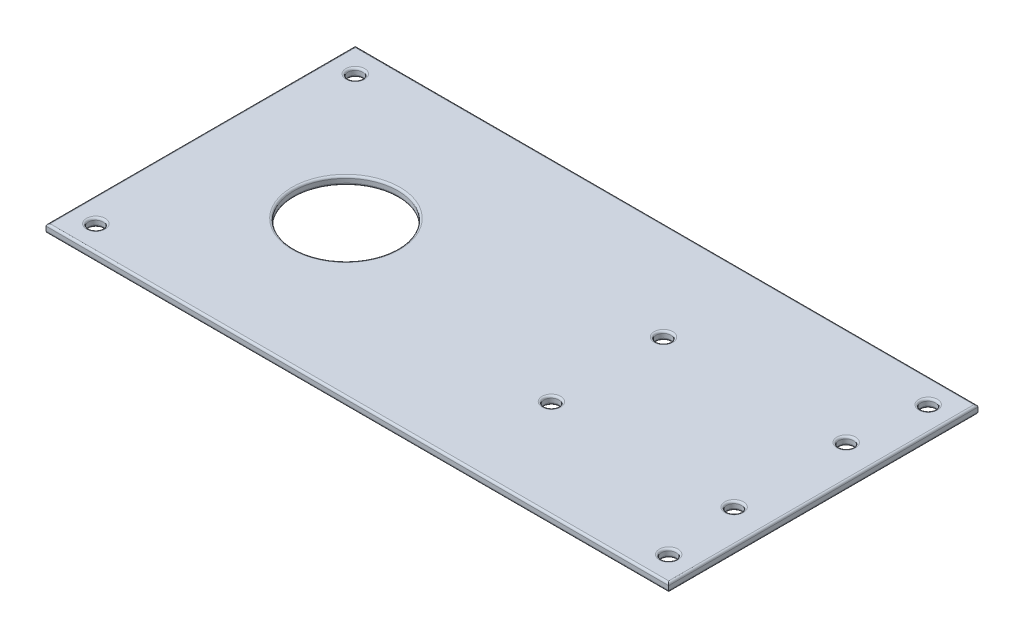
ISO-10303-21;
HEADER;
FILE_DESCRIPTION(('STEP AP214'),'2;1');
FILE_NAME('part.step','',(''),(''),'','','');
FILE_SCHEMA(('AUTOMOTIVE_DESIGN { 1 0 10303 214 1 1 1 1 }'));
ENDSEC;
DATA;
#1=APPLICATION_CONTEXT('core data for automotive mechanical design processes');
#2=APPLICATION_PROTOCOL_DEFINITION('international standard','automotive_design',2000,#1);
#3=PRODUCT_CONTEXT('',#1,'mechanical');
#4=PRODUCT('Part','Part','',(#3));
#5=PRODUCT_RELATED_PRODUCT_CATEGORY('part','',(#4));
#6=PRODUCT_DEFINITION_FORMATION('','',#4);
#7=PRODUCT_DEFINITION_CONTEXT('part definition',#1,'design');
#8=PRODUCT_DEFINITION('design','',#6,#7);
#9=PRODUCT_DEFINITION_SHAPE('','',#8);
#10=(LENGTH_UNIT() NAMED_UNIT(*) SI_UNIT(.MILLI.,.METRE.));
#11=(NAMED_UNIT(*) PLANE_ANGLE_UNIT() SI_UNIT($,.RADIAN.));
#12=(NAMED_UNIT(*) SI_UNIT($,.STERADIAN.) SOLID_ANGLE_UNIT());
#13=UNCERTAINTY_MEASURE_WITH_UNIT(LENGTH_MEASURE(1.E-05),#10,'distance_accuracy_value','');
#14=(GEOMETRIC_REPRESENTATION_CONTEXT(3) GLOBAL_UNCERTAINTY_ASSIGNED_CONTEXT((#13)) GLOBAL_UNIT_ASSIGNED_CONTEXT((#10,
#11,#12)) REPRESENTATION_CONTEXT('',''));
#15=CARTESIAN_POINT('',(0.,0.,0.));
#16=DIRECTION('',(0.,0.,1.));
#17=DIRECTION('',(1.,0.,0.));
#18=AXIS2_PLACEMENT_3D('',#15,#16,#17);
#19=CARTESIAN_POINT('',(0.,2.,0.));
#20=DIRECTION('',(0.,-1.,0.));
#21=DIRECTION('',(0.,0.,-1.));
#22=AXIS2_PLACEMENT_3D('',#19,#20,#21);
#23=PLANE('',#22);
#24=CARTESIAN_POINT('',(98.,2.,-23.75));
#25=DIRECTION('',(0.,-1.,0.));
#26=DIRECTION('',(0.,0.,-1.));
#27=AXIS2_PLACEMENT_3D('',#24,#25,#26);
#28=CIRCLE('',#27,2.25);
#29=CARTESIAN_POINT('',(98.,2.,-26.));
#30=VERTEX_POINT('',#29);
#31=EDGE_CURVE('E11',#30,#30,#28,.T.);
#32=ORIENTED_EDGE('',*,*,#31,.T.);
#33=EDGE_LOOP('',(#32));
#34=FACE_BOUND('',#33,.T.);
#35=CARTESIAN_POINT('',(142.,2.,-23.75));
#36=DIRECTION('',(0.,-1.,0.));
#37=DIRECTION('',(0.,0.,-1.));
#38=AXIS2_PLACEMENT_3D('',#35,#36,#37);
#39=CIRCLE('',#38,2.25000000000001);
#40=CARTESIAN_POINT('',(142.,2.,-26.));
#41=VERTEX_POINT('',#40);
#42=EDGE_CURVE('E48',#41,#41,#39,.T.);
#43=ORIENTED_EDGE('',*,*,#42,.T.);
#44=EDGE_LOOP('',(#43));
#45=FACE_BOUND('',#44,.T.);
#46=CARTESIAN_POINT('',(142.,2.,-50.75));
#47=DIRECTION('',(0.,-1.,0.));
#48=DIRECTION('',(0.,0.,-1.));
#49=AXIS2_PLACEMENT_3D('',#46,#47,#48);
#50=CIRCLE('',#49,2.25000000000001);
#51=CARTESIAN_POINT('',(142.,2.,-53.));
#52=VERTEX_POINT('',#51);
#53=EDGE_CURVE('E250',#52,#52,#50,.T.);
#54=ORIENTED_EDGE('',*,*,#53,.T.);
#55=EDGE_LOOP('',(#54));
#56=FACE_BOUND('',#55,.T.);
#57=CARTESIAN_POINT('',(98.,2.,-50.75));
#58=DIRECTION('',(0.,-1.,0.));
#59=DIRECTION('',(0.,0.,-1.));
#60=AXIS2_PLACEMENT_3D('',#57,#58,#59);
#61=CIRCLE('',#60,2.25);
#62=CARTESIAN_POINT('',(98.,2.,-53.));
#63=VERTEX_POINT('',#62);
#64=EDGE_CURVE('E243',#63,#63,#61,.T.);
#65=ORIENTED_EDGE('',*,*,#64,.T.);
#66=EDGE_LOOP('',(#65));
#67=FACE_BOUND('',#66,.T.);
#68=CARTESIAN_POINT('',(6.,2.,-6.00000000000001));
#69=DIRECTION('',(0.,-1.,0.));
#70=DIRECTION('',(0.,0.,-1.));
#71=AXIS2_PLACEMENT_3D('',#68,#69,#70);
#72=CIRCLE('',#71,2.25);
#73=CARTESIAN_POINT('',(6.,2.,-8.25000000000001));
#74=VERTEX_POINT('',#73);
#75=EDGE_CURVE('E241',#74,#74,#72,.T.);
#76=ORIENTED_EDGE('',*,*,#75,.T.);
#77=EDGE_LOOP('',(#76));
#78=FACE_BOUND('',#77,.T.);
#79=CARTESIAN_POINT('',(6.,2.,-68.5));
#80=DIRECTION('',(0.,-1.,0.));
#81=DIRECTION('',(0.,0.,-1.));
#82=AXIS2_PLACEMENT_3D('',#79,#80,#81);
#83=CIRCLE('',#82,2.25);
#84=CARTESIAN_POINT('',(6.,2.,-70.75));
#85=VERTEX_POINT('',#84);
#86=EDGE_CURVE('E236',#85,#85,#83,.T.);
#87=ORIENTED_EDGE('',*,*,#86,.T.);
#88=EDGE_LOOP('',(#87));
#89=FACE_BOUND('',#88,.T.);
#90=CARTESIAN_POINT('',(35.,2.,-37.25));
#91=DIRECTION('',(0.,-1.,0.));
#92=DIRECTION('',(0.,0.,-1.));
#93=AXIS2_PLACEMENT_3D('',#90,#91,#92);
#94=CIRCLE('',#93,13.);
#95=CARTESIAN_POINT('',(35.,2.,-50.25));
#96=VERTEX_POINT('',#95);
#97=EDGE_CURVE('E232',#96,#96,#94,.T.);
#98=ORIENTED_EDGE('',*,*,#97,.T.);
#99=EDGE_LOOP('',(#98));
#100=FACE_BOUND('',#99,.T.);
#101=CARTESIAN_POINT('',(144.,2.,-68.5));
#102=DIRECTION('',(0.,-1.,0.));
#103=DIRECTION('',(0.,0.,-1.));
#104=AXIS2_PLACEMENT_3D('',#101,#102,#103);
#105=CIRCLE('',#104,2.25000000000001);
#106=CARTESIAN_POINT('',(144.,2.,-70.75));
#107=VERTEX_POINT('',#106);
#108=EDGE_CURVE('E235',#107,#107,#105,.T.);
#109=ORIENTED_EDGE('',*,*,#108,.T.);
#110=EDGE_LOOP('',(#109));
#111=FACE_BOUND('',#110,.T.);
#112=CARTESIAN_POINT('',(144.,2.,-6.));
#113=DIRECTION('',(0.,-1.,0.));
#114=DIRECTION('',(0.,0.,-1.));
#115=AXIS2_PLACEMENT_3D('',#112,#113,#114);
#116=CIRCLE('',#115,2.25000000000001);
#117=CARTESIAN_POINT('',(144.,2.,-8.25000000000001));
#118=VERTEX_POINT('',#117);
#119=EDGE_CURVE('E228',#118,#118,#116,.T.);
#120=ORIENTED_EDGE('',*,*,#119,.T.);
#121=EDGE_LOOP('',(#120));
#122=FACE_BOUND('',#121,.T.);
#123=DIRECTION('',(0.,0.,-1.));
#124=VECTOR('',#123,1.);
#125=CARTESIAN_POINT('',(149.5,2.,0.));
#126=LINE('',#125,#124);
#127=CARTESIAN_POINT('',(149.5,2.,-0.5));
#128=VERTEX_POINT('',#127);
#129=CARTESIAN_POINT('',(149.5,2.,-74.));
#130=VERTEX_POINT('',#129);
#131=EDGE_CURVE('E57',#128,#130,#126,.T.);
#132=ORIENTED_EDGE('',*,*,#131,.T.);
#133=DIRECTION('',(-1.,0.,0.));
#134=VECTOR('',#133,1.);
#135=CARTESIAN_POINT('',(0.,2.,-74.));
#136=LINE('',#135,#134);
#137=CARTESIAN_POINT('',(0.5,2.,-74.));
#138=VERTEX_POINT('',#137);
#139=EDGE_CURVE('E227',#130,#138,#136,.T.);
#140=ORIENTED_EDGE('',*,*,#139,.T.);
#141=DIRECTION('',(0.,0.,1.));
#142=VECTOR('',#141,1.);
#143=CARTESIAN_POINT('',(0.5,2.,0.));
#144=LINE('',#143,#142);
#145=CARTESIAN_POINT('',(0.5,2.,-0.5));
#146=VERTEX_POINT('',#145);
#147=EDGE_CURVE('E224',#138,#146,#144,.T.);
#148=ORIENTED_EDGE('',*,*,#147,.T.);
#149=DIRECTION('',(1.,0.,0.));
#150=VECTOR('',#149,1.);
#151=CARTESIAN_POINT('',(0.,2.,-0.5));
#152=LINE('',#151,#150);
#153=EDGE_CURVE('E61',#146,#128,#152,.T.);
#154=ORIENTED_EDGE('',*,*,#153,.T.);
#155=EDGE_LOOP('',(#132,#140,#148,#154));
#156=FACE_BOUND('',#155,.T.);
#157=ADVANCED_FACE('F39',(#34,#45,#56,#67,#78,#89,#100,#111,#122,#156),#23,.F.);
#158=CARTESIAN_POINT('',(0.,0.,0.));
#159=DIRECTION('',(0.,-1.,0.));
#160=DIRECTION('',(0.,0.,-1.));
#161=AXIS2_PLACEMENT_3D('',#158,#159,#160);
#162=PLANE('',#161);
#163=CARTESIAN_POINT('',(98.,0.,-23.75));
#164=DIRECTION('',(0.,-1.,0.));
#165=DIRECTION('',(0.,0.,-1.));
#166=AXIS2_PLACEMENT_3D('',#163,#164,#165);
#167=CIRCLE('',#166,2.25);
#168=CARTESIAN_POINT('',(98.,0.,-26.));
#169=VERTEX_POINT('',#168);
#170=EDGE_CURVE('E147',#169,#169,#167,.F.);
#171=ORIENTED_EDGE('',*,*,#170,.T.);
#172=EDGE_LOOP('',(#171));
#173=FACE_BOUND('',#172,.T.);
#174=CARTESIAN_POINT('',(142.,0.,-50.75));
#175=DIRECTION('',(0.,-1.,0.));
#176=DIRECTION('',(0.,0.,-1.));
#177=AXIS2_PLACEMENT_3D('',#174,#175,#176);
#178=CIRCLE('',#177,2.25000000000001);
#179=CARTESIAN_POINT('',(142.,0.,-53.));
#180=VERTEX_POINT('',#179);
#181=EDGE_CURVE('E150',#180,#180,#178,.F.);
#182=ORIENTED_EDGE('',*,*,#181,.T.);
#183=EDGE_LOOP('',(#182));
#184=FACE_BOUND('',#183,.T.);
#185=CARTESIAN_POINT('',(6.,0.,-6.00000000000001));
#186=DIRECTION('',(0.,-1.,0.));
#187=DIRECTION('',(0.,0.,-1.));
#188=AXIS2_PLACEMENT_3D('',#185,#186,#187);
#189=CIRCLE('',#188,2.25);
#190=CARTESIAN_POINT('',(6.,0.,-8.25000000000001));
#191=VERTEX_POINT('',#190);
#192=EDGE_CURVE('E145',#191,#191,#189,.F.);
#193=ORIENTED_EDGE('',*,*,#192,.T.);
#194=EDGE_LOOP('',(#193));
#195=FACE_BOUND('',#194,.T.);
#196=CARTESIAN_POINT('',(35.,0.,-37.25));
#197=DIRECTION('',(0.,-1.,0.));
#198=DIRECTION('',(0.,0.,-1.));
#199=AXIS2_PLACEMENT_3D('',#196,#197,#198);
#200=CIRCLE('',#199,13.);
#201=CARTESIAN_POINT('',(35.,0.,-50.25));
#202=VERTEX_POINT('',#201);
#203=EDGE_CURVE('E140',#202,#202,#200,.F.);
#204=ORIENTED_EDGE('',*,*,#203,.T.);
#205=EDGE_LOOP('',(#204));
#206=FACE_BOUND('',#205,.T.);
#207=CARTESIAN_POINT('',(144.,0.,-6.));
#208=DIRECTION('',(0.,-1.,0.));
#209=DIRECTION('',(0.,0.,-1.));
#210=AXIS2_PLACEMENT_3D('',#207,#208,#209);
#211=CIRCLE('',#210,2.25000000000001);
#212=CARTESIAN_POINT('',(144.,0.,-8.25000000000001));
#213=VERTEX_POINT('',#212);
#214=EDGE_CURVE('E133',#213,#213,#211,.F.);
#215=ORIENTED_EDGE('',*,*,#214,.T.);
#216=EDGE_LOOP('',(#215));
#217=FACE_BOUND('',#216,.T.);
#218=DIRECTION('',(0.,0.,-1.));
#219=VECTOR('',#218,1.);
#220=CARTESIAN_POINT('',(149.5,0.,0.));
#221=LINE('',#220,#219);
#222=CARTESIAN_POINT('',(149.5,0.,-74.));
#223=VERTEX_POINT('',#222);
#224=CARTESIAN_POINT('',(149.5,0.,-0.5));
#225=VERTEX_POINT('',#224);
#226=EDGE_CURVE('E134',#223,#225,#221,.F.);
#227=ORIENTED_EDGE('',*,*,#226,.T.);
#228=DIRECTION('',(1.,0.,0.));
#229=VECTOR('',#228,1.);
#230=CARTESIAN_POINT('',(0.,0.,-0.5));
#231=LINE('',#230,#229);
#232=CARTESIAN_POINT('',(0.5,0.,-0.5));
#233=VERTEX_POINT('',#232);
#234=EDGE_CURVE('E112',#225,#233,#231,.F.);
#235=ORIENTED_EDGE('',*,*,#234,.T.);
#236=DIRECTION('',(0.,0.,1.));
#237=VECTOR('',#236,1.);
#238=CARTESIAN_POINT('',(0.5,0.,-74.5));
#239=LINE('',#238,#237);
#240=CARTESIAN_POINT('',(0.5,0.,-74.));
#241=VERTEX_POINT('',#240);
#242=EDGE_CURVE('E123',#233,#241,#239,.F.);
#243=ORIENTED_EDGE('',*,*,#242,.T.);
#244=DIRECTION('',(-1.,0.,0.));
#245=VECTOR('',#244,1.);
#246=CARTESIAN_POINT('',(150.,0.,-74.));
#247=LINE('',#246,#245);
#248=EDGE_CURVE('E130',#241,#223,#247,.F.);
#249=ORIENTED_EDGE('',*,*,#248,.T.);
#250=EDGE_LOOP('',(#227,#235,#243,#249));
#251=FACE_BOUND('',#250,.T.);
#252=CARTESIAN_POINT('',(144.,0.,-68.5));
#253=DIRECTION('',(0.,-1.,0.));
#254=DIRECTION('',(0.,0.,-1.));
#255=AXIS2_PLACEMENT_3D('',#252,#253,#254);
#256=CIRCLE('',#255,2.25000000000001);
#257=CARTESIAN_POINT('',(144.,0.,-70.75));
#258=VERTEX_POINT('',#257);
#259=EDGE_CURVE('E126',#258,#258,#256,.F.);
#260=ORIENTED_EDGE('',*,*,#259,.T.);
#261=EDGE_LOOP('',(#260));
#262=FACE_BOUND('',#261,.T.);
#263=CARTESIAN_POINT('',(6.,0.,-68.5));
#264=DIRECTION('',(0.,-1.,0.));
#265=DIRECTION('',(0.,0.,-1.));
#266=AXIS2_PLACEMENT_3D('',#263,#264,#265);
#267=CIRCLE('',#266,2.25);
#268=CARTESIAN_POINT('',(6.,0.,-70.75));
#269=VERTEX_POINT('',#268);
#270=EDGE_CURVE('E293',#269,#269,#267,.F.);
#271=ORIENTED_EDGE('',*,*,#270,.T.);
#272=EDGE_LOOP('',(#271));
#273=FACE_BOUND('',#272,.T.);
#274=CARTESIAN_POINT('',(98.,0.,-50.75));
#275=DIRECTION('',(0.,-1.,0.));
#276=DIRECTION('',(0.,0.,-1.));
#277=AXIS2_PLACEMENT_3D('',#274,#275,#276);
#278=CIRCLE('',#277,2.25);
#279=CARTESIAN_POINT('',(98.,0.,-53.));
#280=VERTEX_POINT('',#279);
#281=EDGE_CURVE('E290',#280,#280,#278,.F.);
#282=ORIENTED_EDGE('',*,*,#281,.T.);
#283=EDGE_LOOP('',(#282));
#284=FACE_BOUND('',#283,.T.);
#285=CARTESIAN_POINT('',(142.,0.,-23.75));
#286=DIRECTION('',(0.,-1.,0.));
#287=DIRECTION('',(0.,0.,-1.));
#288=AXIS2_PLACEMENT_3D('',#285,#286,#287);
#289=CIRCLE('',#288,2.25000000000001);
#290=CARTESIAN_POINT('',(142.,0.,-26.));
#291=VERTEX_POINT('',#290);
#292=EDGE_CURVE('E283',#291,#291,#289,.F.);
#293=ORIENTED_EDGE('',*,*,#292,.T.);
#294=EDGE_LOOP('',(#293));
#295=FACE_BOUND('',#294,.T.);
#296=ADVANCED_FACE('F128',(#173,#184,#195,#206,#217,#251,#262,#273,#284,#295),#162,.T.);
#297=CARTESIAN_POINT('',(0.,2.,0.));
#298=DIRECTION('',(1.,0.,0.));
#299=DIRECTION('',(0.,0.,-1.));
#300=AXIS2_PLACEMENT_3D('',#297,#298,#299);
#301=PLANE('',#300);
#302=DIRECTION('',(0.,-1.,0.));
#303=VECTOR('',#302,1.);
#304=CARTESIAN_POINT('',(0.,2.,-74.5));
#305=LINE('',#304,#303);
#306=CARTESIAN_POINT('',(0.,1.5,-74.5));
#307=VERTEX_POINT('',#306);
#308=CARTESIAN_POINT('',(0.,0.5,-74.5));
#309=VERTEX_POINT('',#308);
#310=EDGE_CURVE('E258',#307,#309,#305,.T.);
#311=ORIENTED_EDGE('',*,*,#310,.T.);
#312=DIRECTION('',(0.,0.,1.));
#313=VECTOR('',#312,1.);
#314=CARTESIAN_POINT('',(0.,0.5,0.));
#315=LINE('',#314,#313);
#316=CARTESIAN_POINT('',(0.,0.5,0.));
#317=VERTEX_POINT('',#316);
#318=EDGE_CURVE('E197',#309,#317,#315,.T.);
#319=ORIENTED_EDGE('',*,*,#318,.T.);
#320=DIRECTION('',(0.,-1.,0.));
#321=VECTOR('',#320,1.);
#322=CARTESIAN_POINT('',(0.,2.,0.));
#323=LINE('',#322,#321);
#324=CARTESIAN_POINT('',(0.,1.5,0.));
#325=VERTEX_POINT('',#324);
#326=EDGE_CURVE('E280',#325,#317,#323,.T.);
#327=ORIENTED_EDGE('',*,*,#326,.F.);
#328=DIRECTION('',(0.,0.,1.));
#329=VECTOR('',#328,1.);
#330=CARTESIAN_POINT('',(0.,1.5,0.));
#331=LINE('',#330,#329);
#332=EDGE_CURVE('E192',#325,#307,#331,.F.);
#333=ORIENTED_EDGE('',*,*,#332,.T.);
#334=EDGE_LOOP('',(#311,#319,#327,#333));
#335=FACE_BOUND('',#334,.T.);
#336=ADVANCED_FACE('F282',(#335),#301,.F.);
#337=CARTESIAN_POINT('',(0.,2.,0.));
#338=DIRECTION('',(0.,0.,-1.));
#339=DIRECTION('',(-1.,0.,0.));
#340=AXIS2_PLACEMENT_3D('',#337,#338,#339);
#341=PLANE('',#340);
#342=ORIENTED_EDGE('',*,*,#326,.T.);
#343=DIRECTION('',(1.,0.,0.));
#344=VECTOR('',#343,1.);
#345=CARTESIAN_POINT('',(150.,0.5,0.));
#346=LINE('',#345,#344);
#347=CARTESIAN_POINT('',(150.,0.5,0.));
#348=VERTEX_POINT('',#347);
#349=EDGE_CURVE('E111',#317,#348,#346,.T.);
#350=ORIENTED_EDGE('',*,*,#349,.T.);
#351=DIRECTION('',(0.,-1.,0.));
#352=VECTOR('',#351,1.);
#353=CARTESIAN_POINT('',(150.,2.,0.));
#354=LINE('',#353,#352);
#355=CARTESIAN_POINT('',(150.,1.5,0.));
#356=VERTEX_POINT('',#355);
#357=EDGE_CURVE('E276',#356,#348,#354,.T.);
#358=ORIENTED_EDGE('',*,*,#357,.F.);
#359=DIRECTION('',(1.,0.,0.));
#360=VECTOR('',#359,1.);
#361=CARTESIAN_POINT('',(0.,1.5,0.));
#362=LINE('',#361,#360);
#363=EDGE_CURVE('E181',#356,#325,#362,.F.);
#364=ORIENTED_EDGE('',*,*,#363,.T.);
#365=EDGE_LOOP('',(#342,#350,#358,#364));
#366=FACE_BOUND('',#365,.T.);
#367=ADVANCED_FACE('F277',(#366),#341,.F.);
#368=CARTESIAN_POINT('',(150.,2.,0.));
#369=DIRECTION('',(-1.,0.,0.));
#370=DIRECTION('',(0.,0.,1.));
#371=AXIS2_PLACEMENT_3D('',#368,#369,#370);
#372=PLANE('',#371);
#373=ORIENTED_EDGE('',*,*,#357,.T.);
#374=DIRECTION('',(0.,0.,-1.));
#375=VECTOR('',#374,1.);
#376=CARTESIAN_POINT('',(150.,0.5,-74.5));
#377=LINE('',#376,#375);
#378=CARTESIAN_POINT('',(150.,0.5,-74.5));
#379=VERTEX_POINT('',#378);
#380=EDGE_CURVE('E189',#348,#379,#377,.T.);
#381=ORIENTED_EDGE('',*,*,#380,.T.);
#382=DIRECTION('',(0.,-1.,0.));
#383=VECTOR('',#382,1.);
#384=CARTESIAN_POINT('',(150.,2.,-74.5));
#385=LINE('',#384,#383);
#386=CARTESIAN_POINT('',(150.,1.5,-74.5));
#387=VERTEX_POINT('',#386);
#388=EDGE_CURVE('E289',#387,#379,#385,.T.);
#389=ORIENTED_EDGE('',*,*,#388,.F.);
#390=DIRECTION('',(0.,0.,-1.));
#391=VECTOR('',#390,1.);
#392=CARTESIAN_POINT('',(150.,1.5,0.));
#393=LINE('',#392,#391);
#394=EDGE_CURVE('E186',#387,#356,#393,.F.);
#395=ORIENTED_EDGE('',*,*,#394,.T.);
#396=EDGE_LOOP('',(#373,#381,#389,#395));
#397=FACE_BOUND('',#396,.T.);
#398=ADVANCED_FACE('F310',(#397),#372,.F.);
#399=CARTESIAN_POINT('',(0.,2.,-74.5));
#400=DIRECTION('',(0.,0.,1.));
#401=DIRECTION('',(1.,0.,0.));
#402=AXIS2_PLACEMENT_3D('',#399,#400,#401);
#403=PLANE('',#402);
#404=ORIENTED_EDGE('',*,*,#388,.T.);
#405=DIRECTION('',(-1.,0.,0.));
#406=VECTOR('',#405,1.);
#407=CARTESIAN_POINT('',(0.,0.5,-74.5));
#408=LINE('',#407,#406);
#409=EDGE_CURVE('E191',#379,#309,#408,.T.);
#410=ORIENTED_EDGE('',*,*,#409,.T.);
#411=ORIENTED_EDGE('',*,*,#310,.F.);
#412=DIRECTION('',(-1.,0.,0.));
#413=VECTOR('',#412,1.);
#414=CARTESIAN_POINT('',(0.,1.5,-74.5));
#415=LINE('',#414,#413);
#416=EDGE_CURVE('E190',#307,#387,#415,.F.);
#417=ORIENTED_EDGE('',*,*,#416,.T.);
#418=EDGE_LOOP('',(#404,#410,#411,#417));
#419=FACE_BOUND('',#418,.T.);
#420=ADVANCED_FACE('F311',(#419),#403,.F.);
#421=CARTESIAN_POINT('',(144.,2.,-6.));
#422=DIRECTION('',(0.,-1.,0.));
#423=DIRECTION('',(0.,0.,-1.));
#424=AXIS2_PLACEMENT_3D('',#421,#422,#423);
#425=CYLINDRICAL_SURFACE('',#424,1.75000000000001);
#426=CARTESIAN_POINT('',(144.,0.5,-6.));
#427=DIRECTION('',(0.,-1.,0.));
#428=DIRECTION('',(0.,0.,-1.));
#429=AXIS2_PLACEMENT_3D('',#426,#427,#428);
#430=CIRCLE('',#429,1.75000000000001);
#431=CARTESIAN_POINT('',(144.,0.5,-7.75000000000001));
#432=VERTEX_POINT('',#431);
#433=EDGE_CURVE('E177',#432,#432,#430,.T.);
#434=ORIENTED_EDGE('',*,*,#433,.T.);
#435=EDGE_LOOP('',(#434));
#436=FACE_BOUND('',#435,.T.);
#437=CARTESIAN_POINT('',(144.,1.5,-6.));
#438=DIRECTION('',(0.,-1.,0.));
#439=DIRECTION('',(0.,0.,-1.));
#440=AXIS2_PLACEMENT_3D('',#437,#438,#439);
#441=CIRCLE('',#440,1.75000000000001);
#442=CARTESIAN_POINT('',(144.,1.5,-7.75000000000001));
#443=VERTEX_POINT('',#442);
#444=EDGE_CURVE('E180',#443,#443,#441,.F.);
#445=ORIENTED_EDGE('',*,*,#444,.T.);
#446=EDGE_LOOP('',(#445));
#447=FACE_BOUND('',#446,.T.);
#448=ADVANCED_FACE('F328',(#436,#447),#425,.F.);
#449=CARTESIAN_POINT('',(144.,2.,-68.5));
#450=DIRECTION('',(0.,-1.,0.));
#451=DIRECTION('',(0.,0.,-1.));
#452=AXIS2_PLACEMENT_3D('',#449,#450,#451);
#453=CYLINDRICAL_SURFACE('',#452,1.75000000000001);
#454=CARTESIAN_POINT('',(144.,0.5,-68.5));
#455=DIRECTION('',(0.,-1.,0.));
#456=DIRECTION('',(0.,0.,-1.));
#457=AXIS2_PLACEMENT_3D('',#454,#455,#456);
#458=CIRCLE('',#457,1.75000000000001);
#459=CARTESIAN_POINT('',(144.,0.5,-70.25));
#460=VERTEX_POINT('',#459);
#461=EDGE_CURVE('E205',#460,#460,#458,.T.);
#462=ORIENTED_EDGE('',*,*,#461,.T.);
#463=EDGE_LOOP('',(#462));
#464=FACE_BOUND('',#463,.T.);
#465=CARTESIAN_POINT('',(144.,1.5,-68.5));
#466=DIRECTION('',(0.,-1.,0.));
#467=DIRECTION('',(0.,0.,-1.));
#468=AXIS2_PLACEMENT_3D('',#465,#466,#467);
#469=CIRCLE('',#468,1.75000000000001);
#470=CARTESIAN_POINT('',(144.,1.5,-70.25));
#471=VERTEX_POINT('',#470);
#472=EDGE_CURVE('E200',#471,#471,#469,.F.);
#473=ORIENTED_EDGE('',*,*,#472,.T.);
#474=EDGE_LOOP('',(#473));
#475=FACE_BOUND('',#474,.T.);
#476=ADVANCED_FACE('F601',(#464,#475),#453,.F.);
#477=CARTESIAN_POINT('',(35.,2.,-37.25));
#478=DIRECTION('',(0.,-1.,0.));
#479=DIRECTION('',(0.,0.,-1.));
#480=AXIS2_PLACEMENT_3D('',#477,#478,#479);
#481=CYLINDRICAL_SURFACE('',#480,12.5);
#482=CARTESIAN_POINT('',(35.,0.5,-37.25));
#483=DIRECTION('',(0.,-1.,0.));
#484=DIRECTION('',(0.,0.,-1.));
#485=AXIS2_PLACEMENT_3D('',#482,#483,#484);
#486=CIRCLE('',#485,12.5);
#487=CARTESIAN_POINT('',(35.,0.5,-49.75));
#488=VERTEX_POINT('',#487);
#489=EDGE_CURVE('E173',#488,#488,#486,.T.);
#490=ORIENTED_EDGE('',*,*,#489,.T.);
#491=EDGE_LOOP('',(#490));
#492=FACE_BOUND('',#491,.T.);
#493=CARTESIAN_POINT('',(35.,1.5,-37.25));
#494=DIRECTION('',(0.,-1.,0.));
#495=DIRECTION('',(0.,0.,-1.));
#496=AXIS2_PLACEMENT_3D('',#493,#494,#495);
#497=CIRCLE('',#496,12.5);
#498=CARTESIAN_POINT('',(35.,1.5,-49.75));
#499=VERTEX_POINT('',#498);
#500=EDGE_CURVE('E171',#499,#499,#497,.F.);
#501=ORIENTED_EDGE('',*,*,#500,.T.);
#502=EDGE_LOOP('',(#501));
#503=FACE_BOUND('',#502,.T.);
#504=ADVANCED_FACE('F595',(#492,#503),#481,.F.);
#505=CARTESIAN_POINT('',(6.,2.,-68.5));
#506=DIRECTION('',(0.,-1.,0.));
#507=DIRECTION('',(0.,0.,-1.));
#508=AXIS2_PLACEMENT_3D('',#505,#506,#507);
#509=CYLINDRICAL_SURFACE('',#508,1.75);
#510=CARTESIAN_POINT('',(6.,0.5,-68.5));
#511=DIRECTION('',(0.,-1.,0.));
#512=DIRECTION('',(0.,0.,-1.));
#513=AXIS2_PLACEMENT_3D('',#510,#511,#512);
#514=CIRCLE('',#513,1.75);
#515=CARTESIAN_POINT('',(6.,0.5,-70.25));
#516=VERTEX_POINT('',#515);
#517=EDGE_CURVE('E208',#516,#516,#514,.T.);
#518=ORIENTED_EDGE('',*,*,#517,.T.);
#519=EDGE_LOOP('',(#518));
#520=FACE_BOUND('',#519,.T.);
#521=CARTESIAN_POINT('',(6.,1.5,-68.5));
#522=DIRECTION('',(0.,-1.,0.));
#523=DIRECTION('',(0.,0.,-1.));
#524=AXIS2_PLACEMENT_3D('',#521,#522,#523);
#525=CIRCLE('',#524,1.75);
#526=CARTESIAN_POINT('',(6.,1.5,-70.25));
#527=VERTEX_POINT('',#526);
#528=EDGE_CURVE('E202',#527,#527,#525,.F.);
#529=ORIENTED_EDGE('',*,*,#528,.T.);
#530=EDGE_LOOP('',(#529));
#531=FACE_BOUND('',#530,.T.);
#532=ADVANCED_FACE('F581',(#520,#531),#509,.F.);
#533=CARTESIAN_POINT('',(6.,2.,-6.00000000000001));
#534=DIRECTION('',(0.,-1.,0.));
#535=DIRECTION('',(0.,0.,-1.));
#536=AXIS2_PLACEMENT_3D('',#533,#534,#535);
#537=CYLINDRICAL_SURFACE('',#536,1.75);
#538=CARTESIAN_POINT('',(6.,0.5,-6.00000000000001));
#539=DIRECTION('',(0.,-1.,0.));
#540=DIRECTION('',(0.,0.,-1.));
#541=AXIS2_PLACEMENT_3D('',#538,#539,#540);
#542=CIRCLE('',#541,1.75);
#543=CARTESIAN_POINT('',(6.,0.5,-7.75000000000001));
#544=VERTEX_POINT('',#543);
#545=EDGE_CURVE('E169',#544,#544,#542,.T.);
#546=ORIENTED_EDGE('',*,*,#545,.T.);
#547=EDGE_LOOP('',(#546));
#548=FACE_BOUND('',#547,.T.);
#549=CARTESIAN_POINT('',(6.,1.5,-6.00000000000001));
#550=DIRECTION('',(0.,-1.,0.));
#551=DIRECTION('',(0.,0.,-1.));
#552=AXIS2_PLACEMENT_3D('',#549,#550,#551);
#553=CIRCLE('',#552,1.75);
#554=CARTESIAN_POINT('',(6.,1.5,-7.75000000000001));
#555=VERTEX_POINT('',#554);
#556=EDGE_CURVE('E164',#555,#555,#553,.F.);
#557=ORIENTED_EDGE('',*,*,#556,.T.);
#558=EDGE_LOOP('',(#557));
#559=FACE_BOUND('',#558,.T.);
#560=ADVANCED_FACE('F573',(#548,#559),#537,.F.);
#561=CARTESIAN_POINT('',(98.,2.,-50.75));
#562=DIRECTION('',(0.,-1.,0.));
#563=DIRECTION('',(0.,0.,-1.));
#564=AXIS2_PLACEMENT_3D('',#561,#562,#563);
#565=CYLINDRICAL_SURFACE('',#564,1.75);
#566=CARTESIAN_POINT('',(98.,0.5,-50.75));
#567=DIRECTION('',(0.,-1.,0.));
#568=DIRECTION('',(0.,0.,-1.));
#569=AXIS2_PLACEMENT_3D('',#566,#567,#568);
#570=CIRCLE('',#569,1.75);
#571=CARTESIAN_POINT('',(98.,0.5,-52.5));
#572=VERTEX_POINT('',#571);
#573=EDGE_CURVE('E212',#572,#572,#570,.T.);
#574=ORIENTED_EDGE('',*,*,#573,.T.);
#575=EDGE_LOOP('',(#574));
#576=FACE_BOUND('',#575,.T.);
#577=CARTESIAN_POINT('',(98.,1.5,-50.75));
#578=DIRECTION('',(0.,-1.,0.));
#579=DIRECTION('',(0.,0.,-1.));
#580=AXIS2_PLACEMENT_3D('',#577,#578,#579);
#581=CIRCLE('',#580,1.75);
#582=CARTESIAN_POINT('',(98.,1.5,-52.5));
#583=VERTEX_POINT('',#582);
#584=EDGE_CURVE('E211',#583,#583,#581,.F.);
#585=ORIENTED_EDGE('',*,*,#584,.T.);
#586=EDGE_LOOP('',(#585));
#587=FACE_BOUND('',#586,.T.);
#588=ADVANCED_FACE('F562',(#576,#587),#565,.F.);
#589=CARTESIAN_POINT('',(142.,2.,-50.75));
#590=DIRECTION('',(0.,-1.,0.));
#591=DIRECTION('',(0.,0.,-1.));
#592=AXIS2_PLACEMENT_3D('',#589,#590,#591);
#593=CYLINDRICAL_SURFACE('',#592,1.75000000000001);
#594=CARTESIAN_POINT('',(142.,0.5,-50.75));
#595=DIRECTION('',(0.,-1.,0.));
#596=DIRECTION('',(0.,0.,-1.));
#597=AXIS2_PLACEMENT_3D('',#594,#595,#596);
#598=CIRCLE('',#597,1.75000000000001);
#599=CARTESIAN_POINT('',(142.,0.5,-52.5));
#600=VERTEX_POINT('',#599);
#601=EDGE_CURVE('E165',#600,#600,#598,.T.);
#602=ORIENTED_EDGE('',*,*,#601,.T.);
#603=EDGE_LOOP('',(#602));
#604=FACE_BOUND('',#603,.T.);
#605=CARTESIAN_POINT('',(142.,1.5,-50.75));
#606=DIRECTION('',(0.,-1.,0.));
#607=DIRECTION('',(0.,0.,-1.));
#608=AXIS2_PLACEMENT_3D('',#605,#606,#607);
#609=CIRCLE('',#608,1.75000000000001);
#610=CARTESIAN_POINT('',(142.,1.5,-52.5));
#611=VERTEX_POINT('',#610);
#612=EDGE_CURVE('E157',#611,#611,#609,.F.);
#613=ORIENTED_EDGE('',*,*,#612,.T.);
#614=EDGE_LOOP('',(#613));
#615=FACE_BOUND('',#614,.T.);
#616=ADVANCED_FACE('F556',(#604,#615),#593,.F.);
#617=CARTESIAN_POINT('',(142.,2.,-23.75));
#618=DIRECTION('',(0.,-1.,0.));
#619=DIRECTION('',(0.,0.,-1.));
#620=AXIS2_PLACEMENT_3D('',#617,#618,#619);
#621=CYLINDRICAL_SURFACE('',#620,1.75000000000001);
#622=CARTESIAN_POINT('',(142.,0.5,-23.75));
#623=DIRECTION('',(0.,-1.,0.));
#624=DIRECTION('',(0.,0.,-1.));
#625=AXIS2_PLACEMENT_3D('',#622,#623,#624);
#626=CIRCLE('',#625,1.75000000000001);
#627=CARTESIAN_POINT('',(142.,0.5,-25.5));
#628=VERTEX_POINT('',#627);
#629=EDGE_CURVE('E219',#628,#628,#626,.T.);
#630=ORIENTED_EDGE('',*,*,#629,.T.);
#631=EDGE_LOOP('',(#630));
#632=FACE_BOUND('',#631,.T.);
#633=CARTESIAN_POINT('',(142.,1.5,-23.75));
#634=DIRECTION('',(0.,-1.,0.));
#635=DIRECTION('',(0.,0.,-1.));
#636=AXIS2_PLACEMENT_3D('',#633,#634,#635);
#637=CIRCLE('',#636,1.75000000000001);
#638=CARTESIAN_POINT('',(142.,1.5,-25.5));
#639=VERTEX_POINT('',#638);
#640=EDGE_CURVE('E220',#639,#639,#637,.F.);
#641=ORIENTED_EDGE('',*,*,#640,.T.);
#642=EDGE_LOOP('',(#641));
#643=FACE_BOUND('',#642,.T.);
#644=ADVANCED_FACE('F550',(#632,#643),#621,.F.);
#645=CARTESIAN_POINT('',(98.,2.,-23.75));
#646=DIRECTION('',(0.,-1.,0.));
#647=DIRECTION('',(0.,0.,-1.));
#648=AXIS2_PLACEMENT_3D('',#645,#646,#647);
#649=CYLINDRICAL_SURFACE('',#648,1.75);
#650=CARTESIAN_POINT('',(98.,0.5,-23.75));
#651=DIRECTION('',(0.,-1.,0.));
#652=DIRECTION('',(0.,0.,-1.));
#653=AXIS2_PLACEMENT_3D('',#650,#651,#652);
#654=CIRCLE('',#653,1.75);
#655=CARTESIAN_POINT('',(98.,0.5,-25.5));
#656=VERTEX_POINT('',#655);
#657=EDGE_CURVE('E156',#656,#656,#654,.T.);
#658=ORIENTED_EDGE('',*,*,#657,.T.);
#659=EDGE_LOOP('',(#658));
#660=FACE_BOUND('',#659,.T.);
#661=CARTESIAN_POINT('',(98.,1.5,-23.75));
#662=DIRECTION('',(0.,-1.,0.));
#663=DIRECTION('',(0.,0.,-1.));
#664=AXIS2_PLACEMENT_3D('',#661,#662,#663);
#665=CIRCLE('',#664,1.75);
#666=CARTESIAN_POINT('',(98.,1.5,-25.5));
#667=VERTEX_POINT('',#666);
#668=EDGE_CURVE('E153',#667,#667,#665,.F.);
#669=ORIENTED_EDGE('',*,*,#668,.T.);
#670=EDGE_LOOP('',(#669));
#671=FACE_BOUND('',#670,.T.);
#672=ADVANCED_FACE('F344',(#660,#671),#649,.F.);
#673=CARTESIAN_POINT('',(98.,0.5,-23.75));
#674=DIRECTION('',(0.,-1.,0.));
#675=DIRECTION('',(0.,0.,-1.));
#676=AXIS2_PLACEMENT_3D('',#673,#674,#675);
#677=TOROIDAL_SURFACE('',#676,2.25,0.5);
#678=ORIENTED_EDGE('',*,*,#657,.F.);
#679=EDGE_LOOP('',(#678));
#680=FACE_BOUND('',#679,.T.);
#681=ORIENTED_EDGE('',*,*,#170,.F.);
#682=EDGE_LOOP('',(#681));
#683=FACE_BOUND('',#682,.T.);
#684=ADVANCED_FACE('F340',(#680,#683),#677,.T.);
#685=CARTESIAN_POINT('',(142.,0.5,-50.75));
#686=DIRECTION('',(0.,-1.,0.));
#687=DIRECTION('',(0.,0.,-1.));
#688=AXIS2_PLACEMENT_3D('',#685,#686,#687);
#689=TOROIDAL_SURFACE('',#688,2.25000000000001,0.5);
#690=ORIENTED_EDGE('',*,*,#601,.F.);
#691=EDGE_LOOP('',(#690));
#692=FACE_BOUND('',#691,.T.);
#693=ORIENTED_EDGE('',*,*,#181,.F.);
#694=EDGE_LOOP('',(#693));
#695=FACE_BOUND('',#694,.T.);
#696=ADVANCED_FACE('F341',(#692,#695),#689,.T.);
#697=CARTESIAN_POINT('',(6.,0.5,-6.00000000000001));
#698=DIRECTION('',(0.,-1.,0.));
#699=DIRECTION('',(0.,0.,-1.));
#700=AXIS2_PLACEMENT_3D('',#697,#698,#699);
#701=TOROIDAL_SURFACE('',#700,2.25,0.5);
#702=ORIENTED_EDGE('',*,*,#545,.F.);
#703=EDGE_LOOP('',(#702));
#704=FACE_BOUND('',#703,.T.);
#705=ORIENTED_EDGE('',*,*,#192,.F.);
#706=EDGE_LOOP('',(#705));
#707=FACE_BOUND('',#706,.T.);
#708=ADVANCED_FACE('F346',(#704,#707),#701,.T.);
#709=CARTESIAN_POINT('',(35.,0.5,-37.25));
#710=DIRECTION('',(0.,-1.,0.));
#711=DIRECTION('',(0.,0.,-1.));
#712=AXIS2_PLACEMENT_3D('',#709,#710,#711);
#713=TOROIDAL_SURFACE('',#712,13.,0.5);
#714=ORIENTED_EDGE('',*,*,#489,.F.);
#715=EDGE_LOOP('',(#714));
#716=FACE_BOUND('',#715,.T.);
#717=ORIENTED_EDGE('',*,*,#203,.F.);
#718=EDGE_LOOP('',(#717));
#719=FACE_BOUND('',#718,.T.);
#720=ADVANCED_FACE('F352',(#716,#719),#713,.T.);
#721=CARTESIAN_POINT('',(144.,0.5,-6.));
#722=DIRECTION('',(0.,-1.,0.));
#723=DIRECTION('',(0.,0.,-1.));
#724=AXIS2_PLACEMENT_3D('',#721,#722,#723);
#725=TOROIDAL_SURFACE('',#724,2.25000000000001,0.5);
#726=ORIENTED_EDGE('',*,*,#433,.F.);
#727=EDGE_LOOP('',(#726));
#728=FACE_BOUND('',#727,.T.);
#729=ORIENTED_EDGE('',*,*,#214,.F.);
#730=EDGE_LOOP('',(#729));
#731=FACE_BOUND('',#730,.T.);
#732=ADVANCED_FACE('F358',(#728,#731),#725,.T.);
#733=CARTESIAN_POINT('',(0.,0.5,-74.));
#734=DIRECTION('',(1.,0.,0.));
#735=DIRECTION('',(0.,0.,-1.));
#736=AXIS2_PLACEMENT_3D('',#733,#734,#735);
#737=CYLINDRICAL_SURFACE('',#736,0.5);
#738=CARTESIAN_POINT('',(149.5,0.5,-74.));
#739=DIRECTION('',(0.707106781186547,0.,0.707106781186547));
#740=DIRECTION('',(0.707106781186547,0.,-0.707106781186547));
#741=AXIS2_PLACEMENT_3D('',#738,#739,#740);
#742=ELLIPSE('',#741,0.707106781186547,0.5);
#743=EDGE_CURVE('E117',#223,#379,#742,.T.);
#744=ORIENTED_EDGE('',*,*,#743,.F.);
#745=ORIENTED_EDGE('',*,*,#248,.F.);
#746=CARTESIAN_POINT('',(0.5,0.5,-74.));
#747=DIRECTION('',(0.707106781186547,0.,-0.707106781186547));
#748=DIRECTION('',(-0.707106781186547,0.,-0.707106781186547));
#749=AXIS2_PLACEMENT_3D('',#746,#747,#748);
#750=ELLIPSE('',#749,0.707106781186547,0.5);
#751=EDGE_CURVE('E124',#309,#241,#750,.F.);
#752=ORIENTED_EDGE('',*,*,#751,.F.);
#753=ORIENTED_EDGE('',*,*,#409,.F.);
#754=EDGE_LOOP('',(#744,#745,#752,#753));
#755=FACE_BOUND('',#754,.T.);
#756=ADVANCED_FACE('F305',(#755),#737,.T.);
#757=CARTESIAN_POINT('',(0.5,0.5,0.));
#758=DIRECTION('',(0.,0.,-1.));
#759=DIRECTION('',(-1.,0.,0.));
#760=AXIS2_PLACEMENT_3D('',#757,#758,#759);
#761=CYLINDRICAL_SURFACE('',#760,0.5);
#762=ORIENTED_EDGE('',*,*,#751,.T.);
#763=ORIENTED_EDGE('',*,*,#242,.F.);
#764=CARTESIAN_POINT('',(0.5,0.5,-0.5));
#765=DIRECTION('',(-0.707106781186547,0.,-0.707106781186547));
#766=DIRECTION('',(0.707106781186547,0.,-0.707106781186547));
#767=AXIS2_PLACEMENT_3D('',#764,#765,#766);
#768=ELLIPSE('',#767,0.707106781186547,0.5);
#769=EDGE_CURVE('E110',#317,#233,#768,.F.);
#770=ORIENTED_EDGE('',*,*,#769,.F.);
#771=ORIENTED_EDGE('',*,*,#318,.F.);
#772=EDGE_LOOP('',(#762,#763,#770,#771));
#773=FACE_BOUND('',#772,.T.);
#774=ADVANCED_FACE('F125',(#773),#761,.T.);
#775=CARTESIAN_POINT('',(149.5,0.5,0.));
#776=DIRECTION('',(0.,0.,1.));
#777=DIRECTION('',(1.,0.,0.));
#778=AXIS2_PLACEMENT_3D('',#775,#776,#777);
#779=CYLINDRICAL_SURFACE('',#778,0.5);
#780=ORIENTED_EDGE('',*,*,#743,.T.);
#781=ORIENTED_EDGE('',*,*,#380,.F.);
#782=CARTESIAN_POINT('',(149.5,0.5,-0.5));
#783=DIRECTION('',(-0.707106781186547,0.,0.707106781186547));
#784=DIRECTION('',(0.707106781186547,0.,0.707106781186547));
#785=AXIS2_PLACEMENT_3D('',#782,#783,#784);
#786=ELLIPSE('',#785,0.707106781186547,0.5);
#787=EDGE_CURVE('E119',#225,#348,#786,.T.);
#788=ORIENTED_EDGE('',*,*,#787,.F.);
#789=ORIENTED_EDGE('',*,*,#226,.F.);
#790=EDGE_LOOP('',(#780,#781,#788,#789));
#791=FACE_BOUND('',#790,.T.);
#792=ADVANCED_FACE('F302',(#791),#779,.T.);
#793=CARTESIAN_POINT('',(0.,0.5,-0.5));
#794=DIRECTION('',(-1.,0.,0.));
#795=DIRECTION('',(0.,0.,1.));
#796=AXIS2_PLACEMENT_3D('',#793,#794,#795);
#797=CYLINDRICAL_SURFACE('',#796,0.5);
#798=ORIENTED_EDGE('',*,*,#769,.T.);
#799=ORIENTED_EDGE('',*,*,#234,.F.);
#800=ORIENTED_EDGE('',*,*,#787,.T.);
#801=ORIENTED_EDGE('',*,*,#349,.F.);
#802=EDGE_LOOP('',(#798,#799,#800,#801));
#803=FACE_BOUND('',#802,.T.);
#804=ADVANCED_FACE('F108',(#803),#797,.T.);
#805=CARTESIAN_POINT('',(144.,0.5,-68.5));
#806=DIRECTION('',(0.,-1.,0.));
#807=DIRECTION('',(0.,0.,-1.));
#808=AXIS2_PLACEMENT_3D('',#805,#806,#807);
#809=TOROIDAL_SURFACE('',#808,2.25000000000001,0.5);
#810=ORIENTED_EDGE('',*,*,#461,.F.);
#811=EDGE_LOOP('',(#810));
#812=FACE_BOUND('',#811,.T.);
#813=ORIENTED_EDGE('',*,*,#259,.F.);
#814=EDGE_LOOP('',(#813));
#815=FACE_BOUND('',#814,.T.);
#816=ADVANCED_FACE('F361',(#812,#815),#809,.T.);
#817=CARTESIAN_POINT('',(6.,0.5,-68.5));
#818=DIRECTION('',(0.,-1.,0.));
#819=DIRECTION('',(0.,0.,-1.));
#820=AXIS2_PLACEMENT_3D('',#817,#818,#819);
#821=TOROIDAL_SURFACE('',#820,2.25,0.5);
#822=ORIENTED_EDGE('',*,*,#517,.F.);
#823=EDGE_LOOP('',(#822));
#824=FACE_BOUND('',#823,.T.);
#825=ORIENTED_EDGE('',*,*,#270,.F.);
#826=EDGE_LOOP('',(#825));
#827=FACE_BOUND('',#826,.T.);
#828=ADVANCED_FACE('F375',(#824,#827),#821,.T.);
#829=CARTESIAN_POINT('',(98.,0.5,-50.75));
#830=DIRECTION('',(0.,-1.,0.));
#831=DIRECTION('',(0.,0.,-1.));
#832=AXIS2_PLACEMENT_3D('',#829,#830,#831);
#833=TOROIDAL_SURFACE('',#832,2.25,0.5);
#834=ORIENTED_EDGE('',*,*,#573,.F.);
#835=EDGE_LOOP('',(#834));
#836=FACE_BOUND('',#835,.T.);
#837=ORIENTED_EDGE('',*,*,#281,.F.);
#838=EDGE_LOOP('',(#837));
#839=FACE_BOUND('',#838,.T.);
#840=ADVANCED_FACE('F376',(#836,#839),#833,.T.);
#841=CARTESIAN_POINT('',(142.,0.5,-23.75));
#842=DIRECTION('',(0.,-1.,0.));
#843=DIRECTION('',(0.,0.,-1.));
#844=AXIS2_PLACEMENT_3D('',#841,#842,#843);
#845=TOROIDAL_SURFACE('',#844,2.25000000000001,0.5);
#846=ORIENTED_EDGE('',*,*,#629,.F.);
#847=EDGE_LOOP('',(#846));
#848=FACE_BOUND('',#847,.T.);
#849=ORIENTED_EDGE('',*,*,#292,.F.);
#850=EDGE_LOOP('',(#849));
#851=FACE_BOUND('',#850,.T.);
#852=ADVANCED_FACE('F379',(#848,#851),#845,.T.);
#853=CARTESIAN_POINT('',(98.,1.5,-23.75));
#854=DIRECTION('',(0.,-1.,0.));
#855=DIRECTION('',(0.,0.,-1.));
#856=AXIS2_PLACEMENT_3D('',#853,#854,#855);
#857=TOROIDAL_SURFACE('',#856,2.25,0.5);
#858=ORIENTED_EDGE('',*,*,#31,.F.);
#859=EDGE_LOOP('',(#858));
#860=FACE_BOUND('',#859,.T.);
#861=ORIENTED_EDGE('',*,*,#668,.F.);
#862=EDGE_LOOP('',(#861));
#863=FACE_BOUND('',#862,.T.);
#864=ADVANCED_FACE('F383',(#860,#863),#857,.T.);
#865=CARTESIAN_POINT('',(142.,1.5,-23.75));
#866=DIRECTION('',(0.,-1.,0.));
#867=DIRECTION('',(0.,0.,-1.));
#868=AXIS2_PLACEMENT_3D('',#865,#866,#867);
#869=TOROIDAL_SURFACE('',#868,2.25000000000001,0.5);
#870=ORIENTED_EDGE('',*,*,#42,.F.);
#871=EDGE_LOOP('',(#870));
#872=FACE_BOUND('',#871,.T.);
#873=ORIENTED_EDGE('',*,*,#640,.F.);
#874=EDGE_LOOP('',(#873));
#875=FACE_BOUND('',#874,.T.);
#876=ADVANCED_FACE('F389',(#872,#875),#869,.T.);
#877=CARTESIAN_POINT('',(142.,1.5,-50.75));
#878=DIRECTION('',(0.,-1.,0.));
#879=DIRECTION('',(0.,0.,-1.));
#880=AXIS2_PLACEMENT_3D('',#877,#878,#879);
#881=TOROIDAL_SURFACE('',#880,2.25000000000001,0.5);
#882=ORIENTED_EDGE('',*,*,#53,.F.);
#883=EDGE_LOOP('',(#882));
#884=FACE_BOUND('',#883,.T.);
#885=ORIENTED_EDGE('',*,*,#612,.F.);
#886=EDGE_LOOP('',(#885));
#887=FACE_BOUND('',#886,.T.);
#888=ADVANCED_FACE('F392',(#884,#887),#881,.T.);
#889=CARTESIAN_POINT('',(98.,1.5,-50.75));
#890=DIRECTION('',(0.,-1.,0.));
#891=DIRECTION('',(0.,0.,-1.));
#892=AXIS2_PLACEMENT_3D('',#889,#890,#891);
#893=TOROIDAL_SURFACE('',#892,2.25,0.5);
#894=ORIENTED_EDGE('',*,*,#64,.F.);
#895=EDGE_LOOP('',(#894));
#896=FACE_BOUND('',#895,.T.);
#897=ORIENTED_EDGE('',*,*,#584,.F.);
#898=EDGE_LOOP('',(#897));
#899=FACE_BOUND('',#898,.T.);
#900=ADVANCED_FACE('F398',(#896,#899),#893,.T.);
#901=CARTESIAN_POINT('',(6.,1.5,-6.00000000000001));
#902=DIRECTION('',(0.,-1.,0.));
#903=DIRECTION('',(0.,0.,-1.));
#904=AXIS2_PLACEMENT_3D('',#901,#902,#903);
#905=TOROIDAL_SURFACE('',#904,2.25,0.5);
#906=ORIENTED_EDGE('',*,*,#75,.F.);
#907=EDGE_LOOP('',(#906));
#908=FACE_BOUND('',#907,.T.);
#909=ORIENTED_EDGE('',*,*,#556,.F.);
#910=EDGE_LOOP('',(#909));
#911=FACE_BOUND('',#910,.T.);
#912=ADVANCED_FACE('F397',(#908,#911),#905,.T.);
#913=CARTESIAN_POINT('',(6.,1.5,-68.5));
#914=DIRECTION('',(0.,-1.,0.));
#915=DIRECTION('',(0.,0.,-1.));
#916=AXIS2_PLACEMENT_3D('',#913,#914,#915);
#917=TOROIDAL_SURFACE('',#916,2.25,0.5);
#918=ORIENTED_EDGE('',*,*,#86,.F.);
#919=EDGE_LOOP('',(#918));
#920=FACE_BOUND('',#919,.T.);
#921=ORIENTED_EDGE('',*,*,#528,.F.);
#922=EDGE_LOOP('',(#921));
#923=FACE_BOUND('',#922,.T.);
#924=ADVANCED_FACE('F404',(#920,#923),#917,.T.);
#925=CARTESIAN_POINT('',(35.,1.5,-37.25));
#926=DIRECTION('',(0.,-1.,0.));
#927=DIRECTION('',(0.,0.,-1.));
#928=AXIS2_PLACEMENT_3D('',#925,#926,#927);
#929=TOROIDAL_SURFACE('',#928,13.,0.5);
#930=ORIENTED_EDGE('',*,*,#97,.F.);
#931=EDGE_LOOP('',(#930));
#932=FACE_BOUND('',#931,.T.);
#933=ORIENTED_EDGE('',*,*,#500,.F.);
#934=EDGE_LOOP('',(#933));
#935=FACE_BOUND('',#934,.T.);
#936=ADVANCED_FACE('F409',(#932,#935),#929,.T.);
#937=CARTESIAN_POINT('',(144.,1.5,-68.5));
#938=DIRECTION('',(0.,-1.,0.));
#939=DIRECTION('',(0.,0.,-1.));
#940=AXIS2_PLACEMENT_3D('',#937,#938,#939);
#941=TOROIDAL_SURFACE('',#940,2.25000000000001,0.5);
#942=ORIENTED_EDGE('',*,*,#108,.F.);
#943=EDGE_LOOP('',(#942));
#944=FACE_BOUND('',#943,.T.);
#945=ORIENTED_EDGE('',*,*,#472,.F.);
#946=EDGE_LOOP('',(#945));
#947=FACE_BOUND('',#946,.T.);
#948=ADVANCED_FACE('F415',(#944,#947),#941,.T.);
#949=CARTESIAN_POINT('',(144.,1.5,-6.));
#950=DIRECTION('',(0.,-1.,0.));
#951=DIRECTION('',(0.,0.,-1.));
#952=AXIS2_PLACEMENT_3D('',#949,#950,#951);
#953=TOROIDAL_SURFACE('',#952,2.25000000000001,0.5);
#954=ORIENTED_EDGE('',*,*,#119,.F.);
#955=EDGE_LOOP('',(#954));
#956=FACE_BOUND('',#955,.T.);
#957=ORIENTED_EDGE('',*,*,#444,.F.);
#958=EDGE_LOOP('',(#957));
#959=FACE_BOUND('',#958,.T.);
#960=ADVANCED_FACE('F418',(#956,#959),#953,.T.);
#961=CARTESIAN_POINT('',(0.,1.5,-0.5));
#962=DIRECTION('',(1.,0.,0.));
#963=DIRECTION('',(0.,0.,-1.));
#964=AXIS2_PLACEMENT_3D('',#961,#962,#963);
#965=CYLINDRICAL_SURFACE('',#964,0.5);
#966=CARTESIAN_POINT('',(0.5,1.5,-0.5));
#967=DIRECTION('',(0.707106781186547,0.,0.707106781186547));
#968=DIRECTION('',(-0.707106781186547,0.,0.707106781186547));
#969=AXIS2_PLACEMENT_3D('',#966,#967,#968);
#970=ELLIPSE('',#969,0.707106781186547,0.5);
#971=EDGE_CURVE('E257',#325,#146,#970,.F.);
#972=ORIENTED_EDGE('',*,*,#971,.F.);
#973=ORIENTED_EDGE('',*,*,#363,.F.);
#974=CARTESIAN_POINT('',(149.5,1.5,-0.5));
#975=DIRECTION('',(0.707106781186547,0.,-0.707106781186547));
#976=DIRECTION('',(0.707106781186547,0.,0.707106781186547));
#977=AXIS2_PLACEMENT_3D('',#974,#975,#976);
#978=ELLIPSE('',#977,0.707106781186547,0.5);
#979=EDGE_CURVE('E43',#128,#356,#978,.T.);
#980=ORIENTED_EDGE('',*,*,#979,.F.);
#981=ORIENTED_EDGE('',*,*,#153,.F.);
#982=EDGE_LOOP('',(#972,#973,#980,#981));
#983=FACE_BOUND('',#982,.T.);
#984=ADVANCED_FACE('F41',(#983),#965,.T.);
#985=CARTESIAN_POINT('',(149.5,1.5,0.));
#986=DIRECTION('',(0.,0.,-1.));
#987=DIRECTION('',(-1.,0.,0.));
#988=AXIS2_PLACEMENT_3D('',#985,#986,#987);
#989=CYLINDRICAL_SURFACE('',#988,0.5);
#990=ORIENTED_EDGE('',*,*,#979,.T.);
#991=ORIENTED_EDGE('',*,*,#394,.F.);
#992=CARTESIAN_POINT('',(149.5,1.5,-74.));
#993=DIRECTION('',(-0.707106781186547,0.,-0.707106781186547));
#994=DIRECTION('',(0.707106781186547,0.,-0.707106781186547));
#995=AXIS2_PLACEMENT_3D('',#992,#993,#994);
#996=ELLIPSE('',#995,0.707106781186547,0.5);
#997=EDGE_CURVE('E259',#130,#387,#996,.T.);
#998=ORIENTED_EDGE('',*,*,#997,.F.);
#999=ORIENTED_EDGE('',*,*,#131,.F.);
#1000=EDGE_LOOP('',(#990,#991,#998,#999));
#1001=FACE_BOUND('',#1000,.T.);
#1002=ADVANCED_FACE('F267',(#1001),#989,.T.);
#1003=CARTESIAN_POINT('',(0.5,1.5,0.));
#1004=DIRECTION('',(0.,0.,1.));
#1005=DIRECTION('',(1.,0.,0.));
#1006=AXIS2_PLACEMENT_3D('',#1003,#1004,#1005);
#1007=CYLINDRICAL_SURFACE('',#1006,0.5);
#1008=ORIENTED_EDGE('',*,*,#971,.T.);
#1009=ORIENTED_EDGE('',*,*,#147,.F.);
#1010=CARTESIAN_POINT('',(0.5,1.5,-74.));
#1011=DIRECTION('',(-0.707106781186547,0.,0.707106781186547));
#1012=DIRECTION('',(0.707106781186547,0.,0.707106781186547));
#1013=AXIS2_PLACEMENT_3D('',#1010,#1011,#1012);
#1014=ELLIPSE('',#1013,0.707106781186547,0.5);
#1015=EDGE_CURVE('E260',#307,#138,#1014,.F.);
#1016=ORIENTED_EDGE('',*,*,#1015,.F.);
#1017=ORIENTED_EDGE('',*,*,#332,.F.);
#1018=EDGE_LOOP('',(#1008,#1009,#1016,#1017));
#1019=FACE_BOUND('',#1018,.T.);
#1020=ADVANCED_FACE('F318',(#1019),#1007,.T.);
#1021=CARTESIAN_POINT('',(0.,1.5,-74.));
#1022=DIRECTION('',(-1.,0.,0.));
#1023=DIRECTION('',(0.,0.,1.));
#1024=AXIS2_PLACEMENT_3D('',#1021,#1022,#1023);
#1025=CYLINDRICAL_SURFACE('',#1024,0.5);
#1026=ORIENTED_EDGE('',*,*,#997,.T.);
#1027=ORIENTED_EDGE('',*,*,#416,.F.);
#1028=ORIENTED_EDGE('',*,*,#1015,.T.);
#1029=ORIENTED_EDGE('',*,*,#139,.F.);
#1030=EDGE_LOOP('',(#1026,#1027,#1028,#1029));
#1031=FACE_BOUND('',#1030,.T.);
#1032=ADVANCED_FACE('F316',(#1031),#1025,.T.);
#1033=CLOSED_SHELL('',(#157,#296,#336,#367,#398,#420,#448,#476,#504,#532,#560,#588,#616,#644,
#672,#684,#696,#708,#720,#732,#756,#774,#792,#804,#816,#828,#840,#852,#864,#876,#888,#900,#912,
#924,#936,#948,#960,#984,#1002,#1020,#1032));
#1034=MANIFOLD_SOLID_BREP('B2',#1033);
#1035=ADVANCED_BREP_SHAPE_REPRESENTATION('',(#18,#1034),#14);
#1036=SHAPE_DEFINITION_REPRESENTATION(#9,#1035);
ENDSEC;
END-ISO-10303-21;
